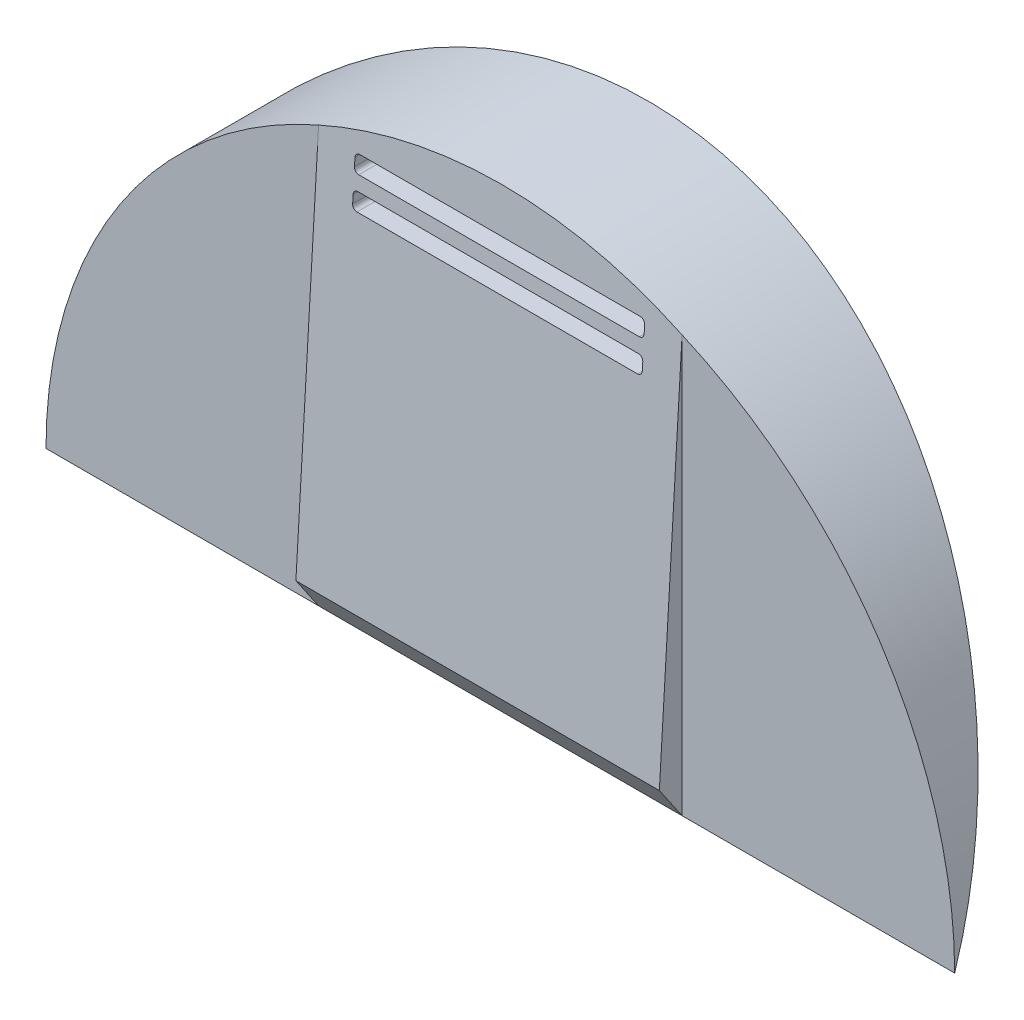
ISO-10303-21;
HEADER;
FILE_DESCRIPTION(('STEP AP214'),'2;1');
FILE_NAME('part.step','',(''),(''),'','','');
FILE_SCHEMA(('AUTOMOTIVE_DESIGN { 1 0 10303 214 1 1 1 1 }'));
ENDSEC;
DATA;
#1=APPLICATION_CONTEXT('core data for automotive mechanical design processes');
#2=APPLICATION_PROTOCOL_DEFINITION('international standard','automotive_design',2000,#1);
#3=PRODUCT_CONTEXT('',#1,'mechanical');
#4=PRODUCT('Part','Part','',(#3));
#5=PRODUCT_RELATED_PRODUCT_CATEGORY('part','',(#4));
#6=PRODUCT_DEFINITION_FORMATION('','',#4);
#7=PRODUCT_DEFINITION_CONTEXT('part definition',#1,'design');
#8=PRODUCT_DEFINITION('design','',#6,#7);
#9=PRODUCT_DEFINITION_SHAPE('','',#8);
#10=(LENGTH_UNIT() NAMED_UNIT(*) SI_UNIT(.MILLI.,.METRE.));
#11=(NAMED_UNIT(*) PLANE_ANGLE_UNIT() SI_UNIT($,.RADIAN.));
#12=(NAMED_UNIT(*) SI_UNIT($,.STERADIAN.) SOLID_ANGLE_UNIT());
#13=UNCERTAINTY_MEASURE_WITH_UNIT(LENGTH_MEASURE(1.E-05),#10,'distance_accuracy_value','');
#14=(GEOMETRIC_REPRESENTATION_CONTEXT(3) GLOBAL_UNCERTAINTY_ASSIGNED_CONTEXT((#13)) GLOBAL_UNIT_ASSIGNED_CONTEXT((#10,
#11,#12)) REPRESENTATION_CONTEXT('',''));
#15=CARTESIAN_POINT('',(0.,0.,0.));
#16=DIRECTION('',(0.,0.,1.));
#17=DIRECTION('',(1.,0.,0.));
#18=AXIS2_PLACEMENT_3D('',#15,#16,#17);
#19=CARTESIAN_POINT('',(326.729552206497,5.83454915863706,30.));
#20=DIRECTION('',(0.,0.0591671338626189,0.998248090541866));
#21=DIRECTION('',(0.,-0.998248090541867,0.0591671338626189));
#22=AXIS2_PLACEMENT_3D('',#19,#20,#21);
#23=PLANE('',#22);
#24=DIRECTION('',(1.,0.,0.));
#25=VECTOR('',#24,1.);
#26=CARTESIAN_POINT('',(-24.7,64.,26.5524772361524));
#27=LINE('',#26,#25);
#28=CARTESIAN_POINT('',(-24.7,64.,26.5524772361524));
#29=VERTEX_POINT('',#28);
#30=CARTESIAN_POINT('',(24.7,64.,26.5524772361524));
#31=VERTEX_POINT('',#30);
#32=EDGE_CURVE('E274',#29,#31,#27,.T.);
#33=ORIENTED_EDGE('',*,*,#32,.F.);
#34=CARTESIAN_POINT('',(-24.7,64.8,26.5050604591622));
#35=DIRECTION('',(0.,0.0591671338626189,0.998248090541866));
#36=DIRECTION('',(0.,0.998248090541867,-0.0591671338626189));
#37=AXIS2_PLACEMENT_3D('',#34,#35,#36);
#38=ELLIPSE('',#37,0.801403987225004,0.799999999999999);
#39=CARTESIAN_POINT('',(-25.5,64.8,26.5050604591622));
#40=VERTEX_POINT('',#39);
#41=EDGE_CURVE('E277',#40,#29,#38,.T.);
#42=ORIENTED_EDGE('',*,*,#41,.F.);
#43=DIRECTION('',(0.,-0.998248090541867,0.0591671338626189));
#44=VECTOR('',#43,1.);
#45=CARTESIAN_POINT('',(-25.5,63.1774573104086,26.601230140249));
#46=LINE('',#45,#44);
#47=CARTESIAN_POINT('',(-25.5,66.2,26.4220810994294));
#48=VERTEX_POINT('',#47);
#49=EDGE_CURVE('E230',#48,#40,#46,.T.);
#50=ORIENTED_EDGE('',*,*,#49,.F.);
#51=CARTESIAN_POINT('',(-24.7,66.2,26.4220810994294));
#52=DIRECTION('',(0.,0.0591671338626189,0.998248090541866));
#53=DIRECTION('',(0.,0.998248090541867,-0.0591671338626189));
#54=AXIS2_PLACEMENT_3D('',#51,#52,#53);
#55=ELLIPSE('',#54,0.801403987225002,0.799999999999997);
#56=CARTESIAN_POINT('',(-24.7,67.,26.3746643224392));
#57=VERTEX_POINT('',#56);
#58=EDGE_CURVE('E63',#57,#48,#55,.T.);
#59=ORIENTED_EDGE('',*,*,#58,.F.);
#60=DIRECTION('',(-1.,0.,0.));
#61=VECTOR('',#60,1.);
#62=CARTESIAN_POINT('',(-24.7,67.,26.3746643224392));
#63=LINE('',#62,#61);
#64=CARTESIAN_POINT('',(24.7,67.,26.3746643224392));
#65=VERTEX_POINT('',#64);
#66=EDGE_CURVE('E262',#65,#57,#63,.T.);
#67=ORIENTED_EDGE('',*,*,#66,.F.);
#68=CARTESIAN_POINT('',(24.7,66.2,26.4220810994294));
#69=DIRECTION('',(0.,0.0591671338626189,0.998248090541866));
#70=DIRECTION('',(0.,0.998248090541867,-0.0591671338626189));
#71=AXIS2_PLACEMENT_3D('',#68,#69,#70);
#72=ELLIPSE('',#71,0.801403987225002,0.799999999999997);
#73=CARTESIAN_POINT('',(25.5,66.2,26.4220810994294));
#74=VERTEX_POINT('',#73);
#75=EDGE_CURVE('E265',#74,#65,#72,.T.);
#76=ORIENTED_EDGE('',*,*,#75,.F.);
#77=DIRECTION('',(0.,0.998248090541867,-0.0591671338626189));
#78=VECTOR('',#77,1.);
#79=CARTESIAN_POINT('',(25.5,63.1774573104086,26.601230140249));
#80=LINE('',#79,#78);
#81=CARTESIAN_POINT('',(25.5,64.8,26.5050604591622));
#82=VERTEX_POINT('',#81);
#83=EDGE_CURVE('E268',#82,#74,#80,.T.);
#84=ORIENTED_EDGE('',*,*,#83,.F.);
#85=CARTESIAN_POINT('',(24.7,64.8,26.5050604591622));
#86=DIRECTION('',(0.,0.0591671338626189,0.998248090541866));
#87=DIRECTION('',(0.,0.998248090541867,-0.0591671338626189));
#88=AXIS2_PLACEMENT_3D('',#85,#86,#87);
#89=ELLIPSE('',#88,0.801403987225004,0.799999999999999);
#90=EDGE_CURVE('E271',#31,#82,#89,.T.);
#91=ORIENTED_EDGE('',*,*,#90,.F.);
#92=EDGE_LOOP('',(#33,#42,#50,#59,#67,#76,#84,#91));
#93=FACE_BOUND('',#92,.T.);
#94=CARTESIAN_POINT('',(0.,0.,30.3458193953667));
#95=DIRECTION('',(0.,0.0591671338626189,0.998248090541866));
#96=DIRECTION('',(0.,0.998248090541867,-0.059167133862619));
#97=AXIS2_PLACEMENT_3D('',#94,#95,#96);
#98=ELLIPSE('',#97,80.1403987225005,80.);
#99=CARTESIAN_POINT('',(32.,73.3212111192935,26.));
#100=VERTEX_POINT('',#99);
#101=CARTESIAN_POINT('',(-32.,73.3212111192935,26.));
#102=VERTEX_POINT('',#101);
#103=EDGE_CURVE('E295',#100,#102,#98,.T.);
#104=ORIENTED_EDGE('',*,*,#103,.T.);
#105=DIRECTION('',(0.,-0.998248090541867,0.0591671338626189));
#106=VECTOR('',#105,1.);
#107=CARTESIAN_POINT('',(-32.,0.0204252963889527,30.3446087682119));
#108=LINE('',#107,#106);
#109=CARTESIAN_POINT('',(-32.,5.83454915863706,30.));
#110=VERTEX_POINT('',#109);
#111=EDGE_CURVE('E302',#102,#110,#108,.T.);
#112=ORIENTED_EDGE('',*,*,#111,.T.);
#113=DIRECTION('',(-1.,0.,0.));
#114=VECTOR('',#113,1.);
#115=CARTESIAN_POINT('',(326.729552206497,5.83454915863706,30.));
#116=LINE('',#115,#114);
#117=CARTESIAN_POINT('',(32.,5.83454915863706,30.));
#118=VERTEX_POINT('',#117);
#119=EDGE_CURVE('E261',#118,#110,#116,.T.);
#120=ORIENTED_EDGE('',*,*,#119,.F.);
#121=DIRECTION('',(0.,0.998248090541867,-0.0591671338626189));
#122=VECTOR('',#121,1.);
#123=CARTESIAN_POINT('',(32.,0.0204252963889527,30.3446087682119));
#124=LINE('',#123,#122);
#125=EDGE_CURVE('E292',#118,#100,#124,.T.);
#126=ORIENTED_EDGE('',*,*,#125,.T.);
#127=EDGE_LOOP('',(#104,#112,#120,#126));
#128=FACE_BOUND('',#127,.T.);
#129=DIRECTION('',(1.,0.,0.));
#130=VECTOR('',#129,1.);
#131=CARTESIAN_POINT('',(-24.7,69.5,26.2264868943449));
#132=LINE('',#131,#130);
#133=CARTESIAN_POINT('',(-24.7,69.5,26.2264868943449));
#134=VERTEX_POINT('',#133);
#135=CARTESIAN_POINT('',(24.7,69.5,26.2264868943449));
#136=VERTEX_POINT('',#135);
#137=EDGE_CURVE('E181',#134,#136,#132,.T.);
#138=ORIENTED_EDGE('',*,*,#137,.F.);
#139=CARTESIAN_POINT('',(-24.7,70.3,26.1790701173547));
#140=DIRECTION('',(0.,0.0591671338626189,0.998248090541866));
#141=DIRECTION('',(0.,0.998248090541867,-0.0591671338626189));
#142=AXIS2_PLACEMENT_3D('',#139,#140,#141);
#143=ELLIPSE('',#142,0.801403987225002,0.799999999999997);
#144=CARTESIAN_POINT('',(-25.5,70.3,26.1790701173547));
#145=VERTEX_POINT('',#144);
#146=EDGE_CURVE('E191',#145,#134,#143,.T.);
#147=ORIENTED_EDGE('',*,*,#146,.F.);
#148=DIRECTION('',(0.,-0.998248090541867,0.059167133862619));
#149=VECTOR('',#148,1.);
#150=CARTESIAN_POINT('',(-25.5,68.6582031868962,26.2763810090424));
#151=LINE('',#150,#149);
#152=CARTESIAN_POINT('',(-25.5,71.7,26.0960907576219));
#153=VERTEX_POINT('',#152);
#154=EDGE_CURVE('E197',#153,#145,#151,.T.);
#155=ORIENTED_EDGE('',*,*,#154,.F.);
#156=CARTESIAN_POINT('',(-24.7,71.7,26.0960907576219));
#157=DIRECTION('',(0.,0.0591671338626189,0.998248090541866));
#158=DIRECTION('',(0.,0.998248090541867,-0.0591671338626189));
#159=AXIS2_PLACEMENT_3D('',#156,#157,#158);
#160=ELLIPSE('',#159,0.801403987225004,0.799999999999999);
#161=CARTESIAN_POINT('',(-24.7,72.5,26.0486739806317));
#162=VERTEX_POINT('',#161);
#163=EDGE_CURVE('E55',#162,#153,#160,.T.);
#164=ORIENTED_EDGE('',*,*,#163,.F.);
#165=DIRECTION('',(-1.,0.,0.));
#166=VECTOR('',#165,1.);
#167=CARTESIAN_POINT('',(-24.7,72.5,26.0486739806317));
#168=LINE('',#167,#166);
#169=CARTESIAN_POINT('',(24.7,72.5,26.0486739806317));
#170=VERTEX_POINT('',#169);
#171=EDGE_CURVE('E614',#170,#162,#168,.T.);
#172=ORIENTED_EDGE('',*,*,#171,.F.);
#173=CARTESIAN_POINT('',(24.7,71.7,26.0960907576219));
#174=DIRECTION('',(0.,0.0591671338626189,0.998248090541866));
#175=DIRECTION('',(0.,0.998248090541867,-0.0591671338626189));
#176=AXIS2_PLACEMENT_3D('',#173,#174,#175);
#177=ELLIPSE('',#176,0.801403987225004,0.799999999999999);
#178=CARTESIAN_POINT('',(25.5,71.7,26.0960907576219));
#179=VERTEX_POINT('',#178);
#180=EDGE_CURVE('E617',#179,#170,#177,.T.);
#181=ORIENTED_EDGE('',*,*,#180,.F.);
#182=DIRECTION('',(0.,0.998248090541867,-0.0591671338626189));
#183=VECTOR('',#182,1.);
#184=CARTESIAN_POINT('',(25.5,68.6582031868962,26.2763810090424));
#185=LINE('',#184,#183);
#186=CARTESIAN_POINT('',(25.5,70.3,26.1790701173547));
#187=VERTEX_POINT('',#186);
#188=EDGE_CURVE('E203',#187,#179,#185,.T.);
#189=ORIENTED_EDGE('',*,*,#188,.F.);
#190=CARTESIAN_POINT('',(24.7,70.3,26.1790701173547));
#191=DIRECTION('',(0.,0.0591671338626189,0.998248090541866));
#192=DIRECTION('',(0.,0.998248090541867,-0.0591671338626189));
#193=AXIS2_PLACEMENT_3D('',#190,#191,#192);
#194=ELLIPSE('',#193,0.801403987225002,0.799999999999997);
#195=EDGE_CURVE('E201',#136,#187,#194,.T.);
#196=ORIENTED_EDGE('',*,*,#195,.F.);
#197=EDGE_LOOP('',(#138,#147,#155,#164,#172,#181,#189,#196));
#198=FACE_BOUND('',#197,.T.);
#199=ADVANCED_FACE('F37',(#93,#128,#198),#23,.T.);
#200=CARTESIAN_POINT('',(0.,0.,26.));
#201=DIRECTION('',(0.,0.,-1.));
#202=DIRECTION('',(-1.,0.,0.));
#203=AXIS2_PLACEMENT_3D('',#200,#201,#202);
#204=CYLINDRICAL_SURFACE('',#203,80.);
#205=ORIENTED_EDGE('',*,*,#103,.F.);
#206=CARTESIAN_POINT('',(0.,0.,26.));
#207=DIRECTION('',(0.,0.,1.));
#208=DIRECTION('',(1.,0.,0.));
#209=AXIS2_PLACEMENT_3D('',#206,#207,#208);
#210=CIRCLE('',#209,80.);
#211=CARTESIAN_POINT('',(80.,0.,26.));
#212=VERTEX_POINT('',#211);
#213=EDGE_CURVE('E345',#212,#100,#210,.T.);
#214=ORIENTED_EDGE('',*,*,#213,.F.);
#215=CARTESIAN_POINT('',(0.,0.,26.));
#216=DIRECTION('',(0.,0.309086072337558,0.951034068730948));
#217=DIRECTION('',(0.,0.951034068730948,-0.309086072337558));
#218=AXIS2_PLACEMENT_3D('',#215,#216,#217);
#219=ELLIPSE('',#218,84.1189633792524,80.);
#220=CARTESIAN_POINT('',(-80.,0.,26.));
#221=VERTEX_POINT('',#220);
#222=EDGE_CURVE('E320',#212,#221,#219,.T.);
#223=ORIENTED_EDGE('',*,*,#222,.T.);
#224=EDGE_CURVE('E346',#102,#221,#210,.T.);
#225=ORIENTED_EDGE('',*,*,#224,.F.);
#226=EDGE_LOOP('',(#205,#214,#223,#225));
#227=FACE_BOUND('',#226,.T.);
#228=ADVANCED_FACE('F39',(#227),#204,.T.);
#229=CARTESIAN_POINT('',(-32.,0.,30.));
#230=DIRECTION('',(1.,0.,0.));
#231=DIRECTION('',(0.,0.,-1.));
#232=AXIS2_PLACEMENT_3D('',#229,#230,#231);
#233=PLANE('',#232);
#234=DIRECTION('',(0.,-0.824783816309643,-0.56544819068921));
#235=VECTOR('',#234,1.);
#236=CARTESIAN_POINT('',(-32.,1.86549006656812,27.2789266254148));
#237=LINE('',#236,#235);
#238=CARTESIAN_POINT('',(-32.,0.,26.));
#239=VERTEX_POINT('',#238);
#240=EDGE_CURVE('E310',#110,#239,#237,.T.);
#241=ORIENTED_EDGE('',*,*,#240,.F.);
#242=ORIENTED_EDGE('',*,*,#111,.F.);
#243=DIRECTION('',(0.,-1.,0.));
#244=VECTOR('',#243,1.);
#245=CARTESIAN_POINT('',(-32.,0.,26.));
#246=LINE('',#245,#244);
#247=EDGE_CURVE('E41',#102,#239,#246,.T.);
#248=ORIENTED_EDGE('',*,*,#247,.T.);
#249=EDGE_LOOP('',(#241,#242,#248));
#250=FACE_BOUND('',#249,.T.);
#251=ADVANCED_FACE('F335',(#250),#233,.F.);
#252=CARTESIAN_POINT('',(32.,0.,30.));
#253=DIRECTION('',(-1.,0.,0.));
#254=DIRECTION('',(0.,0.,1.));
#255=AXIS2_PLACEMENT_3D('',#252,#253,#254);
#256=PLANE('',#255);
#257=DIRECTION('',(0.,0.824783816309643,0.56544819068921));
#258=VECTOR('',#257,1.);
#259=CARTESIAN_POINT('',(32.,1.86549006656812,27.2789266254148));
#260=LINE('',#259,#258);
#261=CARTESIAN_POINT('',(32.,0.,26.));
#262=VERTEX_POINT('',#261);
#263=EDGE_CURVE('E305',#262,#118,#260,.T.);
#264=ORIENTED_EDGE('',*,*,#263,.F.);
#265=DIRECTION('',(0.,1.,0.));
#266=VECTOR('',#265,1.);
#267=CARTESIAN_POINT('',(32.,0.,26.));
#268=LINE('',#267,#266);
#269=EDGE_CURVE('E323',#262,#100,#268,.T.);
#270=ORIENTED_EDGE('',*,*,#269,.T.);
#271=ORIENTED_EDGE('',*,*,#125,.F.);
#272=EDGE_LOOP('',(#264,#270,#271));
#273=FACE_BOUND('',#272,.T.);
#274=ADVANCED_FACE('F349',(#273),#256,.F.);
#275=CARTESIAN_POINT('',(0.,0.,26.));
#276=DIRECTION('',(0.,0.,1.));
#277=DIRECTION('',(1.,0.,0.));
#278=AXIS2_PLACEMENT_3D('',#275,#276,#277);
#279=PLANE('',#278);
#280=ORIENTED_EDGE('',*,*,#247,.F.);
#281=ORIENTED_EDGE('',*,*,#224,.T.);
#282=DIRECTION('',(1.,0.,0.));
#283=VECTOR('',#282,1.);
#284=CARTESIAN_POINT('',(-80.,0.,26.));
#285=LINE('',#284,#283);
#286=EDGE_CURVE('E11',#221,#239,#285,.T.);
#287=ORIENTED_EDGE('',*,*,#286,.T.);
#288=EDGE_LOOP('',(#280,#281,#287));
#289=FACE_BOUND('',#288,.T.);
#290=ADVANCED_FACE('F363',(#289),#279,.T.);
#291=ORIENTED_EDGE('',*,*,#269,.F.);
#292=EDGE_CURVE('E47',#262,#212,#285,.T.);
#293=ORIENTED_EDGE('',*,*,#292,.T.);
#294=ORIENTED_EDGE('',*,*,#213,.T.);
#295=EDGE_LOOP('',(#291,#293,#294));
#296=FACE_BOUND('',#295,.T.);
#297=ADVANCED_FACE('F352',(#296),#279,.T.);
#298=CARTESIAN_POINT('',(-80.,0.,26.));
#299=DIRECTION('',(0.,0.309086072337558,0.951034068730948));
#300=DIRECTION('',(0.,-0.951034068730948,0.309086072337558));
#301=AXIS2_PLACEMENT_3D('',#298,#299,#300);
#302=PLANE('',#301);
#303=ORIENTED_EDGE('',*,*,#222,.F.);
#304=ORIENTED_EDGE('',*,*,#292,.F.);
#305=DIRECTION('',(1.,0.,0.));
#306=VECTOR('',#305,1.);
#307=CARTESIAN_POINT('',(-32.,0.,26.));
#308=LINE('',#307,#306);
#309=EDGE_CURVE('E327',#239,#262,#308,.T.);
#310=ORIENTED_EDGE('',*,*,#309,.F.);
#311=ORIENTED_EDGE('',*,*,#286,.F.);
#312=EDGE_LOOP('',(#303,#304,#310,#311));
#313=FACE_BOUND('',#312,.T.);
#314=ADVANCED_FACE('F362',(#313),#302,.F.);
#315=CARTESIAN_POINT('',(326.729552206497,0.,26.));
#316=DIRECTION('',(0.,-0.565448190689209,0.824783816309643));
#317=DIRECTION('',(0.,-0.824783816309643,-0.56544819068921));
#318=AXIS2_PLACEMENT_3D('',#315,#316,#317);
#319=PLANE('',#318);
#320=ORIENTED_EDGE('',*,*,#119,.T.);
#321=ORIENTED_EDGE('',*,*,#240,.T.);
#322=ORIENTED_EDGE('',*,*,#309,.T.);
#323=ORIENTED_EDGE('',*,*,#263,.T.);
#324=EDGE_LOOP('',(#320,#321,#322,#323));
#325=FACE_BOUND('',#324,.T.);
#326=ADVANCED_FACE('F338',(#325),#319,.T.);
#327=CARTESIAN_POINT('',(-24.7,64.8,77.5965593287764));
#328=DIRECTION('',(0.,0.,-1.));
#329=DIRECTION('',(-1.,0.,0.));
#330=AXIS2_PLACEMENT_3D('',#327,#328,#329);
#331=CYLINDRICAL_SURFACE('',#330,0.799999999999999);
#332=ORIENTED_EDGE('',*,*,#41,.T.);
#333=DIRECTION('',(0.,0.,-1.));
#334=VECTOR('',#333,1.);
#335=CARTESIAN_POINT('',(-24.7,64.,77.5965593287764));
#336=LINE('',#335,#334);
#337=CARTESIAN_POINT('',(-24.7,64.,22.));
#338=VERTEX_POINT('',#337);
#339=EDGE_CURVE('E255',#29,#338,#336,.T.);
#340=ORIENTED_EDGE('',*,*,#339,.T.);
#341=CARTESIAN_POINT('',(-24.7,64.8,22.));
#342=DIRECTION('',(0.,0.,1.));
#343=DIRECTION('',(-1.,0.,0.));
#344=AXIS2_PLACEMENT_3D('',#341,#342,#343);
#345=CIRCLE('',#344,0.799999999999999);
#346=CARTESIAN_POINT('',(-25.5,64.8,22.));
#347=VERTEX_POINT('',#346);
#348=EDGE_CURVE('E256',#347,#338,#345,.T.);
#349=ORIENTED_EDGE('',*,*,#348,.F.);
#350=DIRECTION('',(0.,0.,-1.));
#351=VECTOR('',#350,1.);
#352=CARTESIAN_POINT('',(-25.5,64.8,77.5965593287764));
#353=LINE('',#352,#351);
#354=EDGE_CURVE('E259',#40,#347,#353,.T.);
#355=ORIENTED_EDGE('',*,*,#354,.F.);
#356=EDGE_LOOP('',(#332,#340,#349,#355));
#357=FACE_BOUND('',#356,.T.);
#358=ADVANCED_FACE('F380',(#357),#331,.F.);
#359=CARTESIAN_POINT('',(-24.7,64.,77.5965593287764));
#360=DIRECTION('',(0.,1.,0.));
#361=DIRECTION('',(0.,0.,1.));
#362=AXIS2_PLACEMENT_3D('',#359,#360,#361);
#363=PLANE('',#362);
#364=ORIENTED_EDGE('',*,*,#32,.T.);
#365=DIRECTION('',(0.,0.,-1.));
#366=VECTOR('',#365,1.);
#367=CARTESIAN_POINT('',(24.7,64.,77.5965593287764));
#368=LINE('',#367,#366);
#369=CARTESIAN_POINT('',(24.7,64.,22.));
#370=VERTEX_POINT('',#369);
#371=EDGE_CURVE('E251',#31,#370,#368,.T.);
#372=ORIENTED_EDGE('',*,*,#371,.T.);
#373=DIRECTION('',(1.,0.,0.));
#374=VECTOR('',#373,1.);
#375=CARTESIAN_POINT('',(-24.7,64.,22.));
#376=LINE('',#375,#374);
#377=EDGE_CURVE('E252',#338,#370,#376,.T.);
#378=ORIENTED_EDGE('',*,*,#377,.F.);
#379=ORIENTED_EDGE('',*,*,#339,.F.);
#380=EDGE_LOOP('',(#364,#372,#378,#379));
#381=FACE_BOUND('',#380,.T.);
#382=ADVANCED_FACE('F400',(#381),#363,.T.);
#383=CARTESIAN_POINT('',(24.7,64.8,77.5965593287764));
#384=DIRECTION('',(0.,0.,-1.));
#385=DIRECTION('',(-1.,0.,0.));
#386=AXIS2_PLACEMENT_3D('',#383,#384,#385);
#387=CYLINDRICAL_SURFACE('',#386,0.799999999999999);
#388=ORIENTED_EDGE('',*,*,#90,.T.);
#389=DIRECTION('',(0.,0.,-1.));
#390=VECTOR('',#389,1.);
#391=CARTESIAN_POINT('',(25.5,64.8,77.5965593287764));
#392=LINE('',#391,#390);
#393=CARTESIAN_POINT('',(25.5,64.8,22.));
#394=VERTEX_POINT('',#393);
#395=EDGE_CURVE('E247',#82,#394,#392,.T.);
#396=ORIENTED_EDGE('',*,*,#395,.T.);
#397=CARTESIAN_POINT('',(24.7,64.8,22.));
#398=DIRECTION('',(0.,0.,1.));
#399=DIRECTION('',(1.,0.,0.));
#400=AXIS2_PLACEMENT_3D('',#397,#398,#399);
#401=CIRCLE('',#400,0.799999999999999);
#402=EDGE_CURVE('E248',#370,#394,#401,.T.);
#403=ORIENTED_EDGE('',*,*,#402,.F.);
#404=ORIENTED_EDGE('',*,*,#371,.F.);
#405=EDGE_LOOP('',(#388,#396,#403,#404));
#406=FACE_BOUND('',#405,.T.);
#407=ADVANCED_FACE('F407',(#406),#387,.F.);
#408=CARTESIAN_POINT('',(25.5,66.2,77.5965593287764));
#409=DIRECTION('',(-1.,0.,0.));
#410=DIRECTION('',(0.,-1.,0.));
#411=AXIS2_PLACEMENT_3D('',#408,#409,#410);
#412=PLANE('',#411);
#413=ORIENTED_EDGE('',*,*,#83,.T.);
#414=DIRECTION('',(0.,0.,-1.));
#415=VECTOR('',#414,1.);
#416=CARTESIAN_POINT('',(25.5,66.2,77.5965593287764));
#417=LINE('',#416,#415);
#418=CARTESIAN_POINT('',(25.5,66.2,22.));
#419=VERTEX_POINT('',#418);
#420=EDGE_CURVE('E243',#74,#419,#417,.T.);
#421=ORIENTED_EDGE('',*,*,#420,.T.);
#422=DIRECTION('',(0.,1.,0.));
#423=VECTOR('',#422,1.);
#424=CARTESIAN_POINT('',(25.5,66.2,22.));
#425=LINE('',#424,#423);
#426=EDGE_CURVE('E244',#394,#419,#425,.T.);
#427=ORIENTED_EDGE('',*,*,#426,.F.);
#428=ORIENTED_EDGE('',*,*,#395,.F.);
#429=EDGE_LOOP('',(#413,#421,#427,#428));
#430=FACE_BOUND('',#429,.T.);
#431=ADVANCED_FACE('F414',(#430),#412,.T.);
#432=CARTESIAN_POINT('',(24.7,66.2,77.5965593287764));
#433=DIRECTION('',(0.,0.,-1.));
#434=DIRECTION('',(-1.,0.,0.));
#435=AXIS2_PLACEMENT_3D('',#432,#433,#434);
#436=CYLINDRICAL_SURFACE('',#435,0.799999999999997);
#437=ORIENTED_EDGE('',*,*,#75,.T.);
#438=DIRECTION('',(0.,0.,-1.));
#439=VECTOR('',#438,1.);
#440=CARTESIAN_POINT('',(24.7,67.,77.5965593287764));
#441=LINE('',#440,#439);
#442=CARTESIAN_POINT('',(24.7,67.,22.));
#443=VERTEX_POINT('',#442);
#444=EDGE_CURVE('E239',#65,#443,#441,.T.);
#445=ORIENTED_EDGE('',*,*,#444,.T.);
#446=CARTESIAN_POINT('',(24.7,66.2,22.));
#447=DIRECTION('',(0.,0.,1.));
#448=DIRECTION('',(1.,0.,0.));
#449=AXIS2_PLACEMENT_3D('',#446,#447,#448);
#450=CIRCLE('',#449,0.799999999999997);
#451=EDGE_CURVE('E240',#419,#443,#450,.T.);
#452=ORIENTED_EDGE('',*,*,#451,.F.);
#453=ORIENTED_EDGE('',*,*,#420,.F.);
#454=EDGE_LOOP('',(#437,#445,#452,#453));
#455=FACE_BOUND('',#454,.T.);
#456=ADVANCED_FACE('F422',(#455),#436,.F.);
#457=CARTESIAN_POINT('',(-24.7,67.,77.5965593287764));
#458=DIRECTION('',(0.,-1.,0.));
#459=DIRECTION('',(0.,0.,-1.));
#460=AXIS2_PLACEMENT_3D('',#457,#458,#459);
#461=PLANE('',#460);
#462=ORIENTED_EDGE('',*,*,#66,.T.);
#463=DIRECTION('',(0.,0.,-1.));
#464=VECTOR('',#463,1.);
#465=CARTESIAN_POINT('',(-24.7,67.,77.5965593287764));
#466=LINE('',#465,#464);
#467=CARTESIAN_POINT('',(-24.7,67.,22.));
#468=VERTEX_POINT('',#467);
#469=EDGE_CURVE('E235',#57,#468,#466,.T.);
#470=ORIENTED_EDGE('',*,*,#469,.T.);
#471=DIRECTION('',(-1.,0.,0.));
#472=VECTOR('',#471,1.);
#473=CARTESIAN_POINT('',(-24.7,67.,22.));
#474=LINE('',#473,#472);
#475=EDGE_CURVE('E236',#443,#468,#474,.T.);
#476=ORIENTED_EDGE('',*,*,#475,.F.);
#477=ORIENTED_EDGE('',*,*,#444,.F.);
#478=EDGE_LOOP('',(#462,#470,#476,#477));
#479=FACE_BOUND('',#478,.T.);
#480=ADVANCED_FACE('F430',(#479),#461,.T.);
#481=CARTESIAN_POINT('',(-24.7,66.2,77.5965593287764));
#482=DIRECTION('',(0.,0.,-1.));
#483=DIRECTION('',(-1.,0.,0.));
#484=AXIS2_PLACEMENT_3D('',#481,#482,#483);
#485=CYLINDRICAL_SURFACE('',#484,0.799999999999997);
#486=ORIENTED_EDGE('',*,*,#58,.T.);
#487=DIRECTION('',(0.,0.,-1.));
#488=VECTOR('',#487,1.);
#489=CARTESIAN_POINT('',(-25.5,66.2,77.5965593287764));
#490=LINE('',#489,#488);
#491=CARTESIAN_POINT('',(-25.5,66.2,22.));
#492=VERTEX_POINT('',#491);
#493=EDGE_CURVE('E231',#48,#492,#490,.T.);
#494=ORIENTED_EDGE('',*,*,#493,.T.);
#495=CARTESIAN_POINT('',(-24.7,66.2,22.));
#496=DIRECTION('',(0.,0.,1.));
#497=DIRECTION('',(-1.,0.,0.));
#498=AXIS2_PLACEMENT_3D('',#495,#496,#497);
#499=CIRCLE('',#498,0.799999999999997);
#500=EDGE_CURVE('E232',#468,#492,#499,.T.);
#501=ORIENTED_EDGE('',*,*,#500,.F.);
#502=ORIENTED_EDGE('',*,*,#469,.F.);
#503=EDGE_LOOP('',(#486,#494,#501,#502));
#504=FACE_BOUND('',#503,.T.);
#505=ADVANCED_FACE('F438',(#504),#485,.F.);
#506=CARTESIAN_POINT('',(-25.5,66.2,77.5965593287764));
#507=DIRECTION('',(1.,0.,0.));
#508=DIRECTION('',(0.,1.,0.));
#509=AXIS2_PLACEMENT_3D('',#506,#507,#508);
#510=PLANE('',#509);
#511=ORIENTED_EDGE('',*,*,#49,.T.);
#512=ORIENTED_EDGE('',*,*,#354,.T.);
#513=DIRECTION('',(0.,-1.,0.));
#514=VECTOR('',#513,1.);
#515=CARTESIAN_POINT('',(-25.5,66.2,22.));
#516=LINE('',#515,#514);
#517=EDGE_CURVE('E227',#492,#347,#516,.T.);
#518=ORIENTED_EDGE('',*,*,#517,.F.);
#519=ORIENTED_EDGE('',*,*,#493,.F.);
#520=EDGE_LOOP('',(#511,#512,#518,#519));
#521=FACE_BOUND('',#520,.T.);
#522=ADVANCED_FACE('F446',(#521),#510,.T.);
#523=CARTESIAN_POINT('',(-24.7,64.8,22.));
#524=DIRECTION('',(0.,0.,-1.));
#525=DIRECTION('',(-1.,0.,0.));
#526=AXIS2_PLACEMENT_3D('',#523,#524,#525);
#527=PLANE('',#526);
#528=ORIENTED_EDGE('',*,*,#348,.T.);
#529=ORIENTED_EDGE('',*,*,#377,.T.);
#530=ORIENTED_EDGE('',*,*,#402,.T.);
#531=ORIENTED_EDGE('',*,*,#426,.T.);
#532=ORIENTED_EDGE('',*,*,#451,.T.);
#533=ORIENTED_EDGE('',*,*,#475,.T.);
#534=ORIENTED_EDGE('',*,*,#500,.T.);
#535=ORIENTED_EDGE('',*,*,#517,.T.);
#536=EDGE_LOOP('',(#528,#529,#530,#531,#532,#533,#534,#535));
#537=FACE_BOUND('',#536,.T.);
#538=ADVANCED_FACE('F453',(#537),#527,.F.);
#539=CARTESIAN_POINT('',(-24.7,70.3,77.5965593287764));
#540=DIRECTION('',(0.,0.,-1.));
#541=DIRECTION('',(-1.,0.,0.));
#542=AXIS2_PLACEMENT_3D('',#539,#540,#541);
#543=CYLINDRICAL_SURFACE('',#542,0.799999999999997);
#544=ORIENTED_EDGE('',*,*,#146,.T.);
#545=DIRECTION('',(0.,0.,-1.));
#546=VECTOR('',#545,1.);
#547=CARTESIAN_POINT('',(-24.7,69.5,77.5965593287764));
#548=LINE('',#547,#546);
#549=CARTESIAN_POINT('',(-24.7,69.5,22.));
#550=VERTEX_POINT('',#549);
#551=EDGE_CURVE('E177',#134,#550,#548,.T.);
#552=ORIENTED_EDGE('',*,*,#551,.T.);
#553=CARTESIAN_POINT('',(-24.7,70.3,22.));
#554=DIRECTION('',(0.,0.,1.));
#555=DIRECTION('',(1.,0.,0.));
#556=AXIS2_PLACEMENT_3D('',#553,#554,#555);
#557=CIRCLE('',#556,0.799999999999997);
#558=CARTESIAN_POINT('',(-25.5,70.3,22.));
#559=VERTEX_POINT('',#558);
#560=EDGE_CURVE('E188',#559,#550,#557,.T.);
#561=ORIENTED_EDGE('',*,*,#560,.F.);
#562=DIRECTION('',(0.,0.,-1.));
#563=VECTOR('',#562,1.);
#564=CARTESIAN_POINT('',(-25.5,70.3,77.5965593287764));
#565=LINE('',#564,#563);
#566=EDGE_CURVE('E193',#145,#559,#565,.T.);
#567=ORIENTED_EDGE('',*,*,#566,.F.);
#568=EDGE_LOOP('',(#544,#552,#561,#567));
#569=FACE_BOUND('',#568,.T.);
#570=ADVANCED_FACE('F192',(#569),#543,.F.);
#571=CARTESIAN_POINT('',(-24.7,69.5,77.5965593287764));
#572=DIRECTION('',(0.,1.,0.));
#573=DIRECTION('',(-1.,0.,0.));
#574=AXIS2_PLACEMENT_3D('',#571,#572,#573);
#575=PLANE('',#574);
#576=ORIENTED_EDGE('',*,*,#137,.T.);
#577=DIRECTION('',(0.,0.,-1.));
#578=VECTOR('',#577,1.);
#579=CARTESIAN_POINT('',(24.7,69.5,77.5965593287764));
#580=LINE('',#579,#578);
#581=CARTESIAN_POINT('',(24.7,69.5,22.));
#582=VERTEX_POINT('',#581);
#583=EDGE_CURVE('E209',#136,#582,#580,.T.);
#584=ORIENTED_EDGE('',*,*,#583,.T.);
#585=DIRECTION('',(1.,0.,0.));
#586=VECTOR('',#585,1.);
#587=CARTESIAN_POINT('',(-24.7,69.5,22.));
#588=LINE('',#587,#586);
#589=EDGE_CURVE('E184',#550,#582,#588,.T.);
#590=ORIENTED_EDGE('',*,*,#589,.F.);
#591=ORIENTED_EDGE('',*,*,#551,.F.);
#592=EDGE_LOOP('',(#576,#584,#590,#591));
#593=FACE_BOUND('',#592,.T.);
#594=ADVANCED_FACE('F179',(#593),#575,.T.);
#595=CARTESIAN_POINT('',(24.7,70.3,77.5965593287764));
#596=DIRECTION('',(0.,0.,-1.));
#597=DIRECTION('',(-1.,0.,0.));
#598=AXIS2_PLACEMENT_3D('',#595,#596,#597);
#599=CYLINDRICAL_SURFACE('',#598,0.799999999999997);
#600=ORIENTED_EDGE('',*,*,#195,.T.);
#601=DIRECTION('',(0.,0.,-1.));
#602=VECTOR('',#601,1.);
#603=CARTESIAN_POINT('',(25.5,70.3,77.5965593287764));
#604=LINE('',#603,#602);
#605=CARTESIAN_POINT('',(25.5,70.3,22.));
#606=VERTEX_POINT('',#605);
#607=EDGE_CURVE('E212',#187,#606,#604,.T.);
#608=ORIENTED_EDGE('',*,*,#607,.T.);
#609=CARTESIAN_POINT('',(24.7,70.3,22.));
#610=DIRECTION('',(0.,0.,1.));
#611=DIRECTION('',(1.,0.,0.));
#612=AXIS2_PLACEMENT_3D('',#609,#610,#611);
#613=CIRCLE('',#612,0.799999999999997);
#614=EDGE_CURVE('E211',#582,#606,#613,.T.);
#615=ORIENTED_EDGE('',*,*,#614,.F.);
#616=ORIENTED_EDGE('',*,*,#583,.F.);
#617=EDGE_LOOP('',(#600,#608,#615,#616));
#618=FACE_BOUND('',#617,.T.);
#619=ADVANCED_FACE('F474',(#618),#599,.F.);
#620=CARTESIAN_POINT('',(25.5,71.7,77.5965593287764));
#621=DIRECTION('',(-1.,0.,0.));
#622=DIRECTION('',(0.,-1.,0.));
#623=AXIS2_PLACEMENT_3D('',#620,#621,#622);
#624=PLANE('',#623);
#625=ORIENTED_EDGE('',*,*,#188,.T.);
#626=DIRECTION('',(0.,0.,-1.));
#627=VECTOR('',#626,1.);
#628=CARTESIAN_POINT('',(25.5,71.7,77.5965593287764));
#629=LINE('',#628,#627);
#630=CARTESIAN_POINT('',(25.5,71.7,22.));
#631=VERTEX_POINT('',#630);
#632=EDGE_CURVE('E215',#179,#631,#629,.T.);
#633=ORIENTED_EDGE('',*,*,#632,.T.);
#634=DIRECTION('',(0.,1.,0.));
#635=VECTOR('',#634,1.);
#636=CARTESIAN_POINT('',(25.5,71.7,22.));
#637=LINE('',#636,#635);
#638=EDGE_CURVE('E214',#606,#631,#637,.T.);
#639=ORIENTED_EDGE('',*,*,#638,.F.);
#640=ORIENTED_EDGE('',*,*,#607,.F.);
#641=EDGE_LOOP('',(#625,#633,#639,#640));
#642=FACE_BOUND('',#641,.T.);
#643=ADVANCED_FACE('F481',(#642),#624,.T.);
#644=CARTESIAN_POINT('',(24.7,71.7,77.5965593287764));
#645=DIRECTION('',(0.,0.,-1.));
#646=DIRECTION('',(-1.,0.,0.));
#647=AXIS2_PLACEMENT_3D('',#644,#645,#646);
#648=CYLINDRICAL_SURFACE('',#647,0.799999999999999);
#649=ORIENTED_EDGE('',*,*,#180,.T.);
#650=DIRECTION('',(0.,0.,-1.));
#651=VECTOR('',#650,1.);
#652=CARTESIAN_POINT('',(24.7,72.5,77.5965593287764));
#653=LINE('',#652,#651);
#654=CARTESIAN_POINT('',(24.7,72.5,22.));
#655=VERTEX_POINT('',#654);
#656=EDGE_CURVE('E218',#170,#655,#653,.T.);
#657=ORIENTED_EDGE('',*,*,#656,.T.);
#658=CARTESIAN_POINT('',(24.7,71.7,22.));
#659=DIRECTION('',(0.,0.,1.));
#660=DIRECTION('',(-1.,0.,0.));
#661=AXIS2_PLACEMENT_3D('',#658,#659,#660);
#662=CIRCLE('',#661,0.799999999999999);
#663=EDGE_CURVE('E217',#631,#655,#662,.T.);
#664=ORIENTED_EDGE('',*,*,#663,.F.);
#665=ORIENTED_EDGE('',*,*,#632,.F.);
#666=EDGE_LOOP('',(#649,#657,#664,#665));
#667=FACE_BOUND('',#666,.T.);
#668=ADVANCED_FACE('F489',(#667),#648,.F.);
#669=CARTESIAN_POINT('',(-24.7,72.5,77.5965593287764));
#670=DIRECTION('',(0.,-1.,0.));
#671=DIRECTION('',(0.,0.,-1.));
#672=AXIS2_PLACEMENT_3D('',#669,#670,#671);
#673=PLANE('',#672);
#674=ORIENTED_EDGE('',*,*,#171,.T.);
#675=DIRECTION('',(0.,0.,-1.));
#676=VECTOR('',#675,1.);
#677=CARTESIAN_POINT('',(-24.7,72.5,77.5965593287764));
#678=LINE('',#677,#676);
#679=CARTESIAN_POINT('',(-24.7,72.5,22.));
#680=VERTEX_POINT('',#679);
#681=EDGE_CURVE('E221',#162,#680,#678,.T.);
#682=ORIENTED_EDGE('',*,*,#681,.T.);
#683=DIRECTION('',(-1.,0.,0.));
#684=VECTOR('',#683,1.);
#685=CARTESIAN_POINT('',(-24.7,72.5,22.));
#686=LINE('',#685,#684);
#687=EDGE_CURVE('E220',#655,#680,#686,.T.);
#688=ORIENTED_EDGE('',*,*,#687,.F.);
#689=ORIENTED_EDGE('',*,*,#656,.F.);
#690=EDGE_LOOP('',(#674,#682,#688,#689));
#691=FACE_BOUND('',#690,.T.);
#692=ADVANCED_FACE('F497',(#691),#673,.T.);
#693=CARTESIAN_POINT('',(-24.7,71.7,77.5965593287764));
#694=DIRECTION('',(0.,0.,-1.));
#695=DIRECTION('',(-1.,0.,0.));
#696=AXIS2_PLACEMENT_3D('',#693,#694,#695);
#697=CYLINDRICAL_SURFACE('',#696,0.799999999999999);
#698=ORIENTED_EDGE('',*,*,#163,.T.);
#699=DIRECTION('',(0.,0.,-1.));
#700=VECTOR('',#699,1.);
#701=CARTESIAN_POINT('',(-25.5,71.7,77.5965593287764));
#702=LINE('',#701,#700);
#703=CARTESIAN_POINT('',(-25.5,71.7,22.));
#704=VERTEX_POINT('',#703);
#705=EDGE_CURVE('E224',#153,#704,#702,.T.);
#706=ORIENTED_EDGE('',*,*,#705,.T.);
#707=CARTESIAN_POINT('',(-24.7,71.7,22.));
#708=DIRECTION('',(0.,0.,1.));
#709=DIRECTION('',(-1.,0.,0.));
#710=AXIS2_PLACEMENT_3D('',#707,#708,#709);
#711=CIRCLE('',#710,0.799999999999999);
#712=EDGE_CURVE('E223',#680,#704,#711,.T.);
#713=ORIENTED_EDGE('',*,*,#712,.F.);
#714=ORIENTED_EDGE('',*,*,#681,.F.);
#715=EDGE_LOOP('',(#698,#706,#713,#714));
#716=FACE_BOUND('',#715,.T.);
#717=ADVANCED_FACE('F505',(#716),#697,.F.);
#718=CARTESIAN_POINT('',(-25.5,71.7,77.5965593287764));
#719=DIRECTION('',(1.,0.,0.));
#720=DIRECTION('',(0.,1.,0.));
#721=AXIS2_PLACEMENT_3D('',#718,#719,#720);
#722=PLANE('',#721);
#723=ORIENTED_EDGE('',*,*,#154,.T.);
#724=ORIENTED_EDGE('',*,*,#566,.T.);
#725=DIRECTION('',(0.,-1.,0.));
#726=VECTOR('',#725,1.);
#727=CARTESIAN_POINT('',(-25.5,71.7,22.));
#728=LINE('',#727,#726);
#729=EDGE_CURVE('E207',#704,#559,#728,.T.);
#730=ORIENTED_EDGE('',*,*,#729,.F.);
#731=ORIENTED_EDGE('',*,*,#705,.F.);
#732=EDGE_LOOP('',(#723,#724,#730,#731));
#733=FACE_BOUND('',#732,.T.);
#734=ADVANCED_FACE('F513',(#733),#722,.T.);
#735=CARTESIAN_POINT('',(-24.7,70.3,22.));
#736=DIRECTION('',(0.,0.,1.));
#737=DIRECTION('',(1.,0.,0.));
#738=AXIS2_PLACEMENT_3D('',#735,#736,#737);
#739=PLANE('',#738);
#740=ORIENTED_EDGE('',*,*,#560,.T.);
#741=ORIENTED_EDGE('',*,*,#589,.T.);
#742=ORIENTED_EDGE('',*,*,#614,.T.);
#743=ORIENTED_EDGE('',*,*,#638,.T.);
#744=ORIENTED_EDGE('',*,*,#663,.T.);
#745=ORIENTED_EDGE('',*,*,#687,.T.);
#746=ORIENTED_EDGE('',*,*,#712,.T.);
#747=ORIENTED_EDGE('',*,*,#729,.T.);
#748=EDGE_LOOP('',(#740,#741,#742,#743,#744,#745,#746,#747));
#749=FACE_BOUND('',#748,.T.);
#750=ADVANCED_FACE('F520',(#749),#739,.T.);
#751=CLOSED_SHELL('',(#199,#228,#251,#274,#290,#297,#314,#326,#358,#382,#407,#431,#456,#480,
#505,#522,#538,#570,#594,#619,#643,#668,#692,#717,#734,#750));
#752=MANIFOLD_SOLID_BREP('B2',#751);
#753=ADVANCED_BREP_SHAPE_REPRESENTATION('',(#18,#752),#14);
#754=SHAPE_DEFINITION_REPRESENTATION(#9,#753);
ENDSEC;
END-ISO-10303-21;
